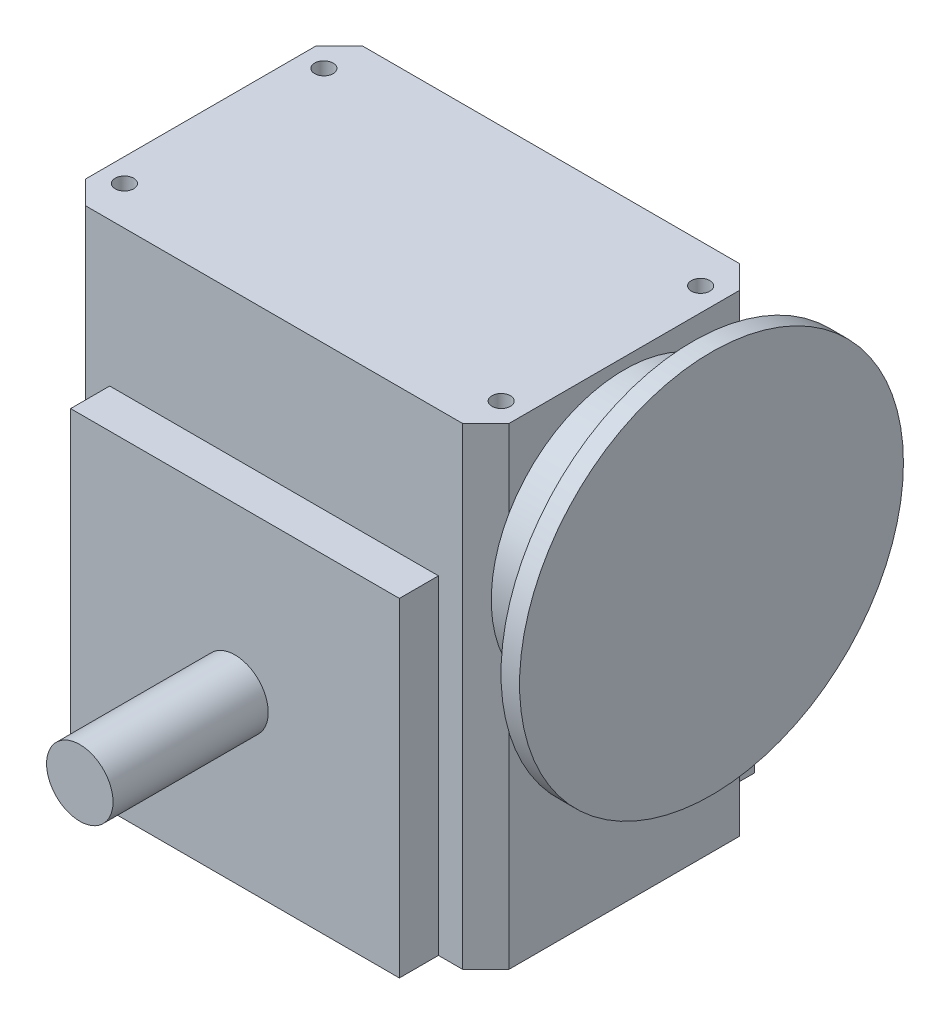
ISO-10303-21;
HEADER;
FILE_DESCRIPTION(('STEP AP214'),'2;1');
FILE_NAME('part.step','',(''),(''),'','','');
FILE_SCHEMA(('AUTOMOTIVE_DESIGN { 1 0 10303 214 1 1 1 1 }'));
ENDSEC;
DATA;
#1=APPLICATION_CONTEXT('core data for automotive mechanical design processes');
#2=APPLICATION_PROTOCOL_DEFINITION('international standard','automotive_design',2000,#1);
#3=PRODUCT_CONTEXT('',#1,'mechanical');
#4=PRODUCT('Part','Part','',(#3));
#5=PRODUCT_RELATED_PRODUCT_CATEGORY('part','',(#4));
#6=PRODUCT_DEFINITION_FORMATION('','',#4);
#7=PRODUCT_DEFINITION_CONTEXT('part definition',#1,'design');
#8=PRODUCT_DEFINITION('design','',#6,#7);
#9=PRODUCT_DEFINITION_SHAPE('','',#8);
#10=(LENGTH_UNIT() NAMED_UNIT(*) SI_UNIT(.MILLI.,.METRE.));
#11=(NAMED_UNIT(*) PLANE_ANGLE_UNIT() SI_UNIT($,.RADIAN.));
#12=(NAMED_UNIT(*) SI_UNIT($,.STERADIAN.) SOLID_ANGLE_UNIT());
#13=UNCERTAINTY_MEASURE_WITH_UNIT(LENGTH_MEASURE(1.E-05),#10,'distance_accuracy_value','');
#14=(GEOMETRIC_REPRESENTATION_CONTEXT(3) GLOBAL_UNCERTAINTY_ASSIGNED_CONTEXT((#13)) GLOBAL_UNIT_ASSIGNED_CONTEXT((#10,
#11,#12)) REPRESENTATION_CONTEXT('',''));
#15=CARTESIAN_POINT('',(0.,0.,0.));
#16=DIRECTION('',(0.,0.,1.));
#17=DIRECTION('',(1.,0.,0.));
#18=AXIS2_PLACEMENT_3D('',#15,#16,#17);
#19=CARTESIAN_POINT('',(128.4986,141.3002,0.));
#20=DIRECTION('',(-1.,0.,0.));
#21=DIRECTION('',(0.,0.,1.));
#22=AXIS2_PLACEMENT_3D('',#19,#20,#21);
#23=CYLINDRICAL_SURFACE('',#22,57.15);
#24=CARTESIAN_POINT('',(90.9955,141.3002,0.));
#25=DIRECTION('',(1.,0.,0.));
#26=DIRECTION('',(0.,0.,-1.));
#27=AXIS2_PLACEMENT_3D('',#24,#25,#26);
#28=CIRCLE('',#27,57.15);
#29=CARTESIAN_POINT('',(90.9955,169.921658344222,-49.4664999999999));
#30=VERTEX_POINT('',#29);
#31=CARTESIAN_POINT('',(90.9955,169.921658344221,49.4665));
#32=VERTEX_POINT('',#31);
#33=EDGE_CURVE('E260',#30,#32,#28,.T.);
#34=ORIENTED_EDGE('',*,*,#33,.T.);
#35=CARTESIAN_POINT('',(90.9955,112.678741655779,49.4665));
#36=VERTEX_POINT('',#35);
#37=EDGE_CURVE('E257',#32,#36,#28,.T.);
#38=ORIENTED_EDGE('',*,*,#37,.T.);
#39=CARTESIAN_POINT('',(90.9955,112.678741655778,-49.4664999999999));
#40=VERTEX_POINT('',#39);
#41=EDGE_CURVE('E51',#36,#40,#28,.T.);
#42=ORIENTED_EDGE('',*,*,#41,.T.);
#43=EDGE_CURVE('E252',#40,#30,#28,.T.);
#44=ORIENTED_EDGE('',*,*,#43,.T.);
#45=EDGE_LOOP('',(#34,#38,#42,#44));
#46=FACE_BOUND('',#45,.T.);
#47=CARTESIAN_POINT('',(120.523,141.3002,0.));
#48=DIRECTION('',(1.,0.,0.));
#49=DIRECTION('',(0.,0.,-1.));
#50=AXIS2_PLACEMENT_3D('',#47,#48,#49);
#51=CIRCLE('',#50,57.15);
#52=CARTESIAN_POINT('',(120.523,141.3002,-57.15));
#53=VERTEX_POINT('',#52);
#54=EDGE_CURVE('E11',#53,#53,#51,.T.);
#55=ORIENTED_EDGE('',*,*,#54,.F.);
#56=EDGE_LOOP('',(#55));
#57=FACE_BOUND('',#56,.T.);
#58=ADVANCED_FACE('F42',(#46,#57),#23,.T.);
#59=CARTESIAN_POINT('',(90.9955,203.2,-59.4995));
#60=DIRECTION('',(-1.,0.,0.));
#61=DIRECTION('',(0.,0.,1.));
#62=AXIS2_PLACEMENT_3D('',#59,#60,#61);
#63=PLANE('',#62);
#64=ORIENTED_EDGE('',*,*,#33,.F.);
#65=DIRECTION('',(0.,1.,0.));
#66=VECTOR('',#65,1.);
#67=CARTESIAN_POINT('',(90.9955,203.2,-49.4664999999999));
#68=LINE('',#67,#66);
#69=CARTESIAN_POINT('',(90.9955,203.2,-49.4664999999999));
#70=VERTEX_POINT('',#69);
#71=EDGE_CURVE('E243',#30,#70,#68,.T.);
#72=ORIENTED_EDGE('',*,*,#71,.T.);
#73=DIRECTION('',(0.,0.,-1.));
#74=VECTOR('',#73,1.);
#75=CARTESIAN_POINT('',(90.9955,203.2,-59.4995));
#76=LINE('',#75,#74);
#77=CARTESIAN_POINT('',(90.9955,203.2,49.4665));
#78=VERTEX_POINT('',#77);
#79=EDGE_CURVE('E345',#78,#70,#76,.T.);
#80=ORIENTED_EDGE('',*,*,#79,.F.);
#81=DIRECTION('',(0.,-1.,0.));
#82=VECTOR('',#81,1.);
#83=CARTESIAN_POINT('',(90.9955,203.2,49.4665));
#84=LINE('',#83,#82);
#85=EDGE_CURVE('E280',#78,#32,#84,.T.);
#86=ORIENTED_EDGE('',*,*,#85,.T.);
#87=EDGE_LOOP('',(#64,#72,#80,#86));
#88=FACE_BOUND('',#87,.T.);
#89=ADVANCED_FACE('F492',(#88),#63,.F.);
#90=CARTESIAN_POINT('',(-90.9955,203.2,59.4995));
#91=DIRECTION('',(0.,0.,-1.));
#92=DIRECTION('',(-1.,0.,0.));
#93=AXIS2_PLACEMENT_3D('',#90,#91,#92);
#94=PLANE('',#93);
#95=DIRECTION('',(1.,0.,0.));
#96=VECTOR('',#95,1.);
#97=CARTESIAN_POINT('',(-90.9955,203.2,59.4995));
#98=LINE('',#97,#96);
#99=CARTESIAN_POINT('',(-80.9625,203.2,59.4995));
#100=VERTEX_POINT('',#99);
#101=CARTESIAN_POINT('',(80.9624999999999,203.2,59.4995));
#102=VERTEX_POINT('',#101);
#103=EDGE_CURVE('E272',#100,#102,#98,.T.);
#104=ORIENTED_EDGE('',*,*,#103,.F.);
#105=DIRECTION('',(0.,-1.,0.));
#106=VECTOR('',#105,1.);
#107=CARTESIAN_POINT('',(-80.9625,203.2,59.4995));
#108=LINE('',#107,#106);
#109=CARTESIAN_POINT('',(-80.9625,0.,59.4995));
#110=VERTEX_POINT('',#109);
#111=EDGE_CURVE('E411',#100,#110,#108,.T.);
#112=ORIENTED_EDGE('',*,*,#111,.T.);
#113=DIRECTION('',(1.,0.,0.));
#114=VECTOR('',#113,1.);
#115=CARTESIAN_POINT('',(-90.9955,0.,59.4995));
#116=LINE('',#115,#114);
#117=CARTESIAN_POINT('',(-70.6501,0.,59.4995));
#118=VERTEX_POINT('',#117);
#119=EDGE_CURVE('E350',#110,#118,#116,.T.);
#120=ORIENTED_EDGE('',*,*,#119,.T.);
#121=DIRECTION('',(0.,-1.,0.));
#122=VECTOR('',#121,1.);
#123=CARTESIAN_POINT('',(-70.6501,0.,59.4995));
#124=LINE('',#123,#122);
#125=CARTESIAN_POINT('',(-70.6501,141.3002,59.4995));
#126=VERTEX_POINT('',#125);
#127=EDGE_CURVE('E462',#126,#118,#124,.T.);
#128=ORIENTED_EDGE('',*,*,#127,.F.);
#129=DIRECTION('',(-1.,0.,0.));
#130=VECTOR('',#129,1.);
#131=CARTESIAN_POINT('',(-70.6501,141.3002,59.4995));
#132=LINE('',#131,#130);
#133=CARTESIAN_POINT('',(70.6501,141.3002,59.4995));
#134=VERTEX_POINT('',#133);
#135=EDGE_CURVE('E308',#134,#126,#132,.T.);
#136=ORIENTED_EDGE('',*,*,#135,.F.);
#137=DIRECTION('',(0.,1.,0.));
#138=VECTOR('',#137,1.);
#139=CARTESIAN_POINT('',(70.6501,0.,59.4995));
#140=LINE('',#139,#138);
#141=CARTESIAN_POINT('',(70.6501,0.,59.4995));
#142=VERTEX_POINT('',#141);
#143=EDGE_CURVE('E311',#142,#134,#140,.T.);
#144=ORIENTED_EDGE('',*,*,#143,.F.);
#145=CARTESIAN_POINT('',(80.9624999999999,0.,59.4995));
#146=VERTEX_POINT('',#145);
#147=EDGE_CURVE('E372',#142,#146,#116,.T.);
#148=ORIENTED_EDGE('',*,*,#147,.T.);
#149=DIRECTION('',(0.,1.,0.));
#150=VECTOR('',#149,1.);
#151=CARTESIAN_POINT('',(80.9624999999999,203.2,59.4995));
#152=LINE('',#151,#150);
#153=EDGE_CURVE('E408',#146,#102,#152,.T.);
#154=ORIENTED_EDGE('',*,*,#153,.T.);
#155=EDGE_LOOP('',(#104,#112,#120,#128,#136,#144,#148,#154));
#156=FACE_BOUND('',#155,.T.);
#157=ADVANCED_FACE('F450',(#156),#94,.F.);
#158=ORIENTED_EDGE('',*,*,#41,.F.);
#159=CARTESIAN_POINT('',(90.9955,0.,49.4665));
#160=VERTEX_POINT('',#159);
#161=EDGE_CURVE('E281',#36,#160,#84,.T.);
#162=ORIENTED_EDGE('',*,*,#161,.T.);
#163=DIRECTION('',(0.,0.,-1.));
#164=VECTOR('',#163,1.);
#165=CARTESIAN_POINT('',(90.9955,0.,-59.4995));
#166=LINE('',#165,#164);
#167=CARTESIAN_POINT('',(90.9955,0.,-49.4664999999999));
#168=VERTEX_POINT('',#167);
#169=EDGE_CURVE('E239',#160,#168,#166,.T.);
#170=ORIENTED_EDGE('',*,*,#169,.T.);
#171=EDGE_CURVE('E235',#168,#40,#68,.T.);
#172=ORIENTED_EDGE('',*,*,#171,.T.);
#173=EDGE_LOOP('',(#158,#162,#170,#172));
#174=FACE_BOUND('',#173,.T.);
#175=ADVANCED_FACE('F237',(#174),#63,.F.);
#176=CARTESIAN_POINT('',(-90.9955,203.2,-59.4995));
#177=DIRECTION('',(0.,0.,1.));
#178=DIRECTION('',(1.,0.,0.));
#179=AXIS2_PLACEMENT_3D('',#176,#177,#178);
#180=PLANE('',#179);
#181=DIRECTION('',(-1.,0.,0.));
#182=VECTOR('',#181,1.);
#183=CARTESIAN_POINT('',(-70.6501,141.3002,-59.4995));
#184=LINE('',#183,#182);
#185=CARTESIAN_POINT('',(70.6501,141.3002,-59.4995));
#186=VERTEX_POINT('',#185);
#187=CARTESIAN_POINT('',(-70.6501,141.3002,-59.4995));
#188=VERTEX_POINT('',#187);
#189=EDGE_CURVE('E470',#186,#188,#184,.T.);
#190=ORIENTED_EDGE('',*,*,#189,.T.);
#191=DIRECTION('',(0.,-1.,0.));
#192=VECTOR('',#191,1.);
#193=CARTESIAN_POINT('',(-70.6501,0.,-59.4995));
#194=LINE('',#193,#192);
#195=CARTESIAN_POINT('',(-70.6501,0.,-59.4995));
#196=VERTEX_POINT('',#195);
#197=EDGE_CURVE('E269',#188,#196,#194,.T.);
#198=ORIENTED_EDGE('',*,*,#197,.T.);
#199=DIRECTION('',(-1.,0.,0.));
#200=VECTOR('',#199,1.);
#201=CARTESIAN_POINT('',(-90.9955,0.,-59.4995));
#202=LINE('',#201,#200);
#203=CARTESIAN_POINT('',(-80.9624999999999,0.,-59.4995));
#204=VERTEX_POINT('',#203);
#205=EDGE_CURVE('E363',#196,#204,#202,.T.);
#206=ORIENTED_EDGE('',*,*,#205,.T.);
#207=DIRECTION('',(0.,1.,0.));
#208=VECTOR('',#207,1.);
#209=CARTESIAN_POINT('',(-80.9624999999999,203.2,-59.4995));
#210=LINE('',#209,#208);
#211=CARTESIAN_POINT('',(-80.9624999999999,203.2,-59.4995));
#212=VERTEX_POINT('',#211);
#213=EDGE_CURVE('E286',#204,#212,#210,.T.);
#214=ORIENTED_EDGE('',*,*,#213,.T.);
#215=DIRECTION('',(-1.,0.,0.));
#216=VECTOR('',#215,1.);
#217=CARTESIAN_POINT('',(-90.9955,203.2,-59.4995));
#218=LINE('',#217,#216);
#219=CARTESIAN_POINT('',(80.9624999999999,203.2,-59.4995));
#220=VERTEX_POINT('',#219);
#221=EDGE_CURVE('E349',#220,#212,#218,.T.);
#222=ORIENTED_EDGE('',*,*,#221,.F.);
#223=DIRECTION('',(0.,-1.,0.));
#224=VECTOR('',#223,1.);
#225=CARTESIAN_POINT('',(80.9624999999999,203.2,-59.4995));
#226=LINE('',#225,#224);
#227=CARTESIAN_POINT('',(80.9624999999999,0.,-59.4995));
#228=VERTEX_POINT('',#227);
#229=EDGE_CURVE('E398',#220,#228,#226,.T.);
#230=ORIENTED_EDGE('',*,*,#229,.T.);
#231=CARTESIAN_POINT('',(70.6501,0.,-59.4995));
#232=VERTEX_POINT('',#231);
#233=EDGE_CURVE('E364',#228,#232,#202,.T.);
#234=ORIENTED_EDGE('',*,*,#233,.T.);
#235=DIRECTION('',(0.,1.,0.));
#236=VECTOR('',#235,1.);
#237=CARTESIAN_POINT('',(70.6501,0.,-59.4995));
#238=LINE('',#237,#236);
#239=EDGE_CURVE('E472',#232,#186,#238,.T.);
#240=ORIENTED_EDGE('',*,*,#239,.T.);
#241=EDGE_LOOP('',(#190,#198,#206,#214,#222,#230,#234,#240));
#242=FACE_BOUND('',#241,.T.);
#243=ADVANCED_FACE('F433',(#242),#180,.F.);
#244=CARTESIAN_POINT('',(-90.9955,203.2,-59.4995));
#245=DIRECTION('',(1.,0.,0.));
#246=DIRECTION('',(0.,0.,-1.));
#247=AXIS2_PLACEMENT_3D('',#244,#245,#246);
#248=PLANE('',#247);
#249=DIRECTION('',(0.,0.,1.));
#250=VECTOR('',#249,1.);
#251=CARTESIAN_POINT('',(-90.9955,203.2,-59.4995));
#252=LINE('',#251,#250);
#253=CARTESIAN_POINT('',(-90.9955,203.2,-49.4664999999999));
#254=VERTEX_POINT('',#253);
#255=CARTESIAN_POINT('',(-90.9955,203.2,49.4665));
#256=VERTEX_POINT('',#255);
#257=EDGE_CURVE('E354',#254,#256,#252,.T.);
#258=ORIENTED_EDGE('',*,*,#257,.F.);
#259=DIRECTION('',(0.,-1.,0.));
#260=VECTOR('',#259,1.);
#261=CARTESIAN_POINT('',(-90.9955,203.2,-49.4664999999999));
#262=LINE('',#261,#260);
#263=CARTESIAN_POINT('',(-90.9955,0.,-49.4664999999999));
#264=VERTEX_POINT('',#263);
#265=EDGE_CURVE('E381',#254,#264,#262,.T.);
#266=ORIENTED_EDGE('',*,*,#265,.T.);
#267=DIRECTION('',(0.,0.,1.));
#268=VECTOR('',#267,1.);
#269=CARTESIAN_POINT('',(-90.9955,0.,-59.4995));
#270=LINE('',#269,#268);
#271=CARTESIAN_POINT('',(-90.9955,0.,49.4665));
#272=VERTEX_POINT('',#271);
#273=EDGE_CURVE('E368',#264,#272,#270,.T.);
#274=ORIENTED_EDGE('',*,*,#273,.T.);
#275=DIRECTION('',(0.,1.,0.));
#276=VECTOR('',#275,1.);
#277=CARTESIAN_POINT('',(-90.9955,203.2,49.4665));
#278=LINE('',#277,#276);
#279=EDGE_CURVE('E378',#272,#256,#278,.T.);
#280=ORIENTED_EDGE('',*,*,#279,.T.);
#281=EDGE_LOOP('',(#258,#266,#274,#280));
#282=FACE_BOUND('',#281,.T.);
#283=ADVANCED_FACE('F444',(#282),#248,.F.);
#284=CARTESIAN_POINT('',(0.,203.2,0.));
#285=DIRECTION('',(0.,1.,0.));
#286=DIRECTION('',(0.,0.,1.));
#287=AXIS2_PLACEMENT_3D('',#284,#285,#286);
#288=PLANE('',#287);
#289=CARTESIAN_POINT('',(80.9625,203.2,-42.8625));
#290=DIRECTION('',(0.,1.,0.));
#291=DIRECTION('',(0.,0.,1.));
#292=AXIS2_PLACEMENT_3D('',#289,#290,#291);
#293=CIRCLE('',#292,3.96874999999999);
#294=CARTESIAN_POINT('',(80.9625,203.2,-38.89375));
#295=VERTEX_POINT('',#294);
#296=EDGE_CURVE('E324',#295,#295,#293,.T.);
#297=ORIENTED_EDGE('',*,*,#296,.F.);
#298=EDGE_LOOP('',(#297));
#299=FACE_BOUND('',#298,.T.);
#300=CARTESIAN_POINT('',(80.9625,203.2,42.8625));
#301=DIRECTION('',(0.,1.,0.));
#302=DIRECTION('',(0.,0.,1.));
#303=AXIS2_PLACEMENT_3D('',#300,#301,#302);
#304=CIRCLE('',#303,3.96874999999999);
#305=CARTESIAN_POINT('',(80.9625,203.2,46.83125));
#306=VERTEX_POINT('',#305);
#307=EDGE_CURVE('E288',#306,#306,#304,.T.);
#308=ORIENTED_EDGE('',*,*,#307,.F.);
#309=EDGE_LOOP('',(#308));
#310=FACE_BOUND('',#309,.T.);
#311=CARTESIAN_POINT('',(-80.9625,203.2,42.8625));
#312=DIRECTION('',(0.,1.,0.));
#313=DIRECTION('',(0.,0.,1.));
#314=AXIS2_PLACEMENT_3D('',#311,#312,#313);
#315=CIRCLE('',#314,3.96874999999999);
#316=CARTESIAN_POINT('',(-80.9625,203.2,46.83125));
#317=VERTEX_POINT('',#316);
#318=EDGE_CURVE('E296',#317,#317,#315,.T.);
#319=ORIENTED_EDGE('',*,*,#318,.F.);
#320=EDGE_LOOP('',(#319));
#321=FACE_BOUND('',#320,.T.);
#322=CARTESIAN_POINT('',(-80.9625,203.2,-42.8625));
#323=DIRECTION('',(0.,1.,0.));
#324=DIRECTION('',(0.,0.,1.));
#325=AXIS2_PLACEMENT_3D('',#322,#323,#324);
#326=CIRCLE('',#325,3.96874999999999);
#327=CARTESIAN_POINT('',(-80.9625,203.2,-38.89375));
#328=VERTEX_POINT('',#327);
#329=EDGE_CURVE('E277',#328,#328,#326,.T.);
#330=ORIENTED_EDGE('',*,*,#329,.F.);
#331=EDGE_LOOP('',(#330));
#332=FACE_BOUND('',#331,.T.);
#333=ORIENTED_EDGE('',*,*,#221,.T.);
#334=DIRECTION('',(0.70710678118655,0.,-0.707106781186546));
#335=VECTOR('',#334,1.);
#336=CARTESIAN_POINT('',(-70.2309999999997,203.2,-70.2310000000001));
#337=LINE('',#336,#335);
#338=EDGE_CURVE('E328',#212,#254,#337,.F.);
#339=ORIENTED_EDGE('',*,*,#338,.T.);
#340=ORIENTED_EDGE('',*,*,#257,.T.);
#341=DIRECTION('',(-0.707106781186547,0.,-0.707106781186549));
#342=VECTOR('',#341,1.);
#343=CARTESIAN_POINT('',(-70.2310000000001,203.2,70.2309999999999));
#344=LINE('',#343,#342);
#345=EDGE_CURVE('E326',#256,#100,#344,.F.);
#346=ORIENTED_EDGE('',*,*,#345,.T.);
#347=ORIENTED_EDGE('',*,*,#103,.T.);
#348=DIRECTION('',(-0.707106781186549,0.,0.707106781186546));
#349=VECTOR('',#348,1.);
#350=CARTESIAN_POINT('',(70.2309999999997,203.2,70.2310000000001));
#351=LINE('',#350,#349);
#352=EDGE_CURVE('E283',#102,#78,#351,.F.);
#353=ORIENTED_EDGE('',*,*,#352,.T.);
#354=ORIENTED_EDGE('',*,*,#79,.T.);
#355=DIRECTION('',(0.707106781186547,0.,0.707106781186549));
#356=VECTOR('',#355,1.);
#357=CARTESIAN_POINT('',(70.2310000000001,203.2,-70.2309999999999));
#358=LINE('',#357,#356);
#359=EDGE_CURVE('E285',#70,#220,#358,.F.);
#360=ORIENTED_EDGE('',*,*,#359,.T.);
#361=EDGE_LOOP('',(#333,#339,#340,#346,#347,#353,#354,#360));
#362=FACE_BOUND('',#361,.T.);
#363=ADVANCED_FACE('F438',(#299,#310,#321,#332,#362),#288,.T.);
#364=CARTESIAN_POINT('',(0.,0.,0.));
#365=DIRECTION('',(0.,1.,0.));
#366=DIRECTION('',(0.,0.,1.));
#367=AXIS2_PLACEMENT_3D('',#364,#365,#366);
#368=PLANE('',#367);
#369=CARTESIAN_POINT('',(-80.9625,0.,-42.8625));
#370=DIRECTION('',(0.,-1.,0.));
#371=DIRECTION('',(0.,0.,-1.));
#372=AXIS2_PLACEMENT_3D('',#369,#370,#371);
#373=CIRCLE('',#372,3.96874999999999);
#374=CARTESIAN_POINT('',(-80.9625,0.,-46.83125));
#375=VERTEX_POINT('',#374);
#376=EDGE_CURVE('E477',#375,#375,#373,.T.);
#377=ORIENTED_EDGE('',*,*,#376,.F.);
#378=EDGE_LOOP('',(#377));
#379=FACE_BOUND('',#378,.T.);
#380=CARTESIAN_POINT('',(-80.9625,0.,42.8625));
#381=DIRECTION('',(0.,-1.,0.));
#382=DIRECTION('',(0.,0.,-1.));
#383=AXIS2_PLACEMENT_3D('',#380,#381,#382);
#384=CIRCLE('',#383,3.96874999999999);
#385=CARTESIAN_POINT('',(-80.9625,0.,38.89375));
#386=VERTEX_POINT('',#385);
#387=EDGE_CURVE('E976',#386,#386,#384,.T.);
#388=ORIENTED_EDGE('',*,*,#387,.F.);
#389=EDGE_LOOP('',(#388));
#390=FACE_BOUND('',#389,.T.);
#391=CARTESIAN_POINT('',(80.9625,0.,42.8625));
#392=DIRECTION('',(0.,-1.,0.));
#393=DIRECTION('',(0.,0.,-1.));
#394=AXIS2_PLACEMENT_3D('',#391,#392,#393);
#395=CIRCLE('',#394,3.96874999999999);
#396=CARTESIAN_POINT('',(80.9625,0.,38.89375));
#397=VERTEX_POINT('',#396);
#398=EDGE_CURVE('E984',#397,#397,#395,.T.);
#399=ORIENTED_EDGE('',*,*,#398,.F.);
#400=EDGE_LOOP('',(#399));
#401=FACE_BOUND('',#400,.T.);
#402=CARTESIAN_POINT('',(80.9625,0.,-42.8625));
#403=DIRECTION('',(0.,-1.,0.));
#404=DIRECTION('',(0.,0.,-1.));
#405=AXIS2_PLACEMENT_3D('',#402,#403,#404);
#406=CIRCLE('',#405,3.96874999999999);
#407=CARTESIAN_POINT('',(80.9625,0.,-46.83125));
#408=VERTEX_POINT('',#407);
#409=EDGE_CURVE('E943',#408,#408,#406,.T.);
#410=ORIENTED_EDGE('',*,*,#409,.F.);
#411=EDGE_LOOP('',(#410));
#412=FACE_BOUND('',#411,.T.);
#413=ORIENTED_EDGE('',*,*,#273,.F.);
#414=DIRECTION('',(-0.70710678118655,0.,0.707106781186546));
#415=VECTOR('',#414,1.);
#416=CARTESIAN_POINT('',(-90.9955,0.,-49.4664999999999));
#417=LINE('',#416,#415);
#418=EDGE_CURVE('E394',#264,#204,#417,.F.);
#419=ORIENTED_EDGE('',*,*,#418,.T.);
#420=ORIENTED_EDGE('',*,*,#205,.F.);
#421=DIRECTION('',(0.,0.,1.));
#422=VECTOR('',#421,1.);
#423=CARTESIAN_POINT('',(-70.6501,0.,-76.3016));
#424=LINE('',#423,#422);
#425=CARTESIAN_POINT('',(-70.6501,0.,-76.3016));
#426=VERTEX_POINT('',#425);
#427=EDGE_CURVE('E954',#426,#196,#424,.T.);
#428=ORIENTED_EDGE('',*,*,#427,.F.);
#429=DIRECTION('',(1.,0.,0.));
#430=VECTOR('',#429,1.);
#431=CARTESIAN_POINT('',(-70.6501,0.,-76.3016));
#432=LINE('',#431,#430);
#433=CARTESIAN_POINT('',(70.6501,0.,-76.3016));
#434=VERTEX_POINT('',#433);
#435=EDGE_CURVE('E956',#426,#434,#432,.T.);
#436=ORIENTED_EDGE('',*,*,#435,.T.);
#437=DIRECTION('',(0.,0.,1.));
#438=VECTOR('',#437,1.);
#439=CARTESIAN_POINT('',(70.6501,0.,-76.3016));
#440=LINE('',#439,#438);
#441=EDGE_CURVE('E480',#434,#232,#440,.T.);
#442=ORIENTED_EDGE('',*,*,#441,.T.);
#443=ORIENTED_EDGE('',*,*,#233,.F.);
#444=DIRECTION('',(-0.707106781186547,0.,-0.707106781186549));
#445=VECTOR('',#444,1.);
#446=CARTESIAN_POINT('',(80.9624999999999,0.,-59.4995));
#447=LINE('',#446,#445);
#448=EDGE_CURVE('E388',#228,#168,#447,.F.);
#449=ORIENTED_EDGE('',*,*,#448,.T.);
#450=ORIENTED_EDGE('',*,*,#169,.F.);
#451=DIRECTION('',(0.707106781186549,0.,-0.707106781186546));
#452=VECTOR('',#451,1.);
#453=CARTESIAN_POINT('',(90.9955,0.,49.4665));
#454=LINE('',#453,#452);
#455=EDGE_CURVE('E385',#160,#146,#454,.F.);
#456=ORIENTED_EDGE('',*,*,#455,.T.);
#457=ORIENTED_EDGE('',*,*,#147,.F.);
#458=DIRECTION('',(0.,0.,-1.));
#459=VECTOR('',#458,1.);
#460=CARTESIAN_POINT('',(70.6501,0.,76.3016));
#461=LINE('',#460,#459);
#462=CARTESIAN_POINT('',(70.6501,0.,76.3016));
#463=VERTEX_POINT('',#462);
#464=EDGE_CURVE('E306',#463,#142,#461,.T.);
#465=ORIENTED_EDGE('',*,*,#464,.F.);
#466=DIRECTION('',(1.,0.,0.));
#467=VECTOR('',#466,1.);
#468=CARTESIAN_POINT('',(-70.6501,0.,76.3016));
#469=LINE('',#468,#467);
#470=CARTESIAN_POINT('',(-70.6501,0.,76.3016));
#471=VERTEX_POINT('',#470);
#472=EDGE_CURVE('E457',#471,#463,#469,.T.);
#473=ORIENTED_EDGE('',*,*,#472,.F.);
#474=DIRECTION('',(0.,0.,-1.));
#475=VECTOR('',#474,1.);
#476=CARTESIAN_POINT('',(-70.6501,0.,76.3016));
#477=LINE('',#476,#475);
#478=EDGE_CURVE('E341',#471,#118,#477,.T.);
#479=ORIENTED_EDGE('',*,*,#478,.T.);
#480=ORIENTED_EDGE('',*,*,#119,.F.);
#481=DIRECTION('',(0.707106781186547,0.,0.707106781186549));
#482=VECTOR('',#481,1.);
#483=CARTESIAN_POINT('',(-80.9625,0.,59.4995));
#484=LINE('',#483,#482);
#485=EDGE_CURVE('E391',#110,#272,#484,.F.);
#486=ORIENTED_EDGE('',*,*,#485,.T.);
#487=EDGE_LOOP('',(#413,#419,#420,#428,#436,#442,#443,#449,#450,#456,#457,#465,#473,#479,#480,#486));
#488=FACE_BOUND('',#487,.T.);
#489=ADVANCED_FACE('F427',(#379,#390,#401,#412,#488),#368,.F.);
#490=CARTESIAN_POINT('',(-70.6501,0.,76.3016));
#491=DIRECTION('',(1.,0.,0.));
#492=DIRECTION('',(0.,0.,-1.));
#493=AXIS2_PLACEMENT_3D('',#490,#491,#492);
#494=PLANE('',#493);
#495=ORIENTED_EDGE('',*,*,#127,.T.);
#496=ORIENTED_EDGE('',*,*,#478,.F.);
#497=DIRECTION('',(0.,-1.,0.));
#498=VECTOR('',#497,1.);
#499=CARTESIAN_POINT('',(-70.6501,0.,76.3016));
#500=LINE('',#499,#498);
#501=CARTESIAN_POINT('',(-70.6501,141.3002,76.3016));
#502=VERTEX_POINT('',#501);
#503=EDGE_CURVE('E310',#502,#471,#500,.T.);
#504=ORIENTED_EDGE('',*,*,#503,.F.);
#505=DIRECTION('',(0.,0.,-1.));
#506=VECTOR('',#505,1.);
#507=CARTESIAN_POINT('',(-70.6501,141.3002,76.3016));
#508=LINE('',#507,#506);
#509=EDGE_CURVE('E300',#502,#126,#508,.T.);
#510=ORIENTED_EDGE('',*,*,#509,.T.);
#511=EDGE_LOOP('',(#495,#496,#504,#510));
#512=FACE_BOUND('',#511,.T.);
#513=ADVANCED_FACE('F612',(#512),#494,.F.);
#514=CARTESIAN_POINT('',(70.6501,0.,76.3016));
#515=DIRECTION('',(-1.,0.,0.));
#516=DIRECTION('',(0.,0.,1.));
#517=AXIS2_PLACEMENT_3D('',#514,#515,#516);
#518=PLANE('',#517);
#519=ORIENTED_EDGE('',*,*,#143,.T.);
#520=DIRECTION('',(0.,0.,-1.));
#521=VECTOR('',#520,1.);
#522=CARTESIAN_POINT('',(70.6501,141.3002,76.3016));
#523=LINE('',#522,#521);
#524=CARTESIAN_POINT('',(70.6501,141.3002,76.3016));
#525=VERTEX_POINT('',#524);
#526=EDGE_CURVE('E303',#525,#134,#523,.T.);
#527=ORIENTED_EDGE('',*,*,#526,.F.);
#528=DIRECTION('',(0.,1.,0.));
#529=VECTOR('',#528,1.);
#530=CARTESIAN_POINT('',(70.6501,0.,76.3016));
#531=LINE('',#530,#529);
#532=EDGE_CURVE('E301',#463,#525,#531,.T.);
#533=ORIENTED_EDGE('',*,*,#532,.F.);
#534=ORIENTED_EDGE('',*,*,#464,.T.);
#535=EDGE_LOOP('',(#519,#527,#533,#534));
#536=FACE_BOUND('',#535,.T.);
#537=ADVANCED_FACE('F608',(#536),#518,.F.);
#538=CARTESIAN_POINT('',(-70.6501,141.3002,76.3016));
#539=DIRECTION('',(0.,-1.,0.));
#540=DIRECTION('',(0.,0.,-1.));
#541=AXIS2_PLACEMENT_3D('',#538,#539,#540);
#542=PLANE('',#541);
#543=ORIENTED_EDGE('',*,*,#135,.T.);
#544=ORIENTED_EDGE('',*,*,#509,.F.);
#545=DIRECTION('',(-1.,0.,0.));
#546=VECTOR('',#545,1.);
#547=CARTESIAN_POINT('',(-70.6501,141.3002,76.3016));
#548=LINE('',#547,#546);
#549=EDGE_CURVE('E298',#525,#502,#548,.T.);
#550=ORIENTED_EDGE('',*,*,#549,.F.);
#551=ORIENTED_EDGE('',*,*,#526,.T.);
#552=EDGE_LOOP('',(#543,#544,#550,#551));
#553=FACE_BOUND('',#552,.T.);
#554=ADVANCED_FACE('F604',(#553),#542,.F.);
#555=CARTESIAN_POINT('',(0.,0.,76.3016));
#556=DIRECTION('',(0.,0.,-1.));
#557=DIRECTION('',(-1.,0.,0.));
#558=AXIS2_PLACEMENT_3D('',#555,#556,#557);
#559=PLANE('',#558);
#560=CARTESIAN_POINT('',(0.,70.6501,76.3016));
#561=DIRECTION('',(0.,0.,-1.));
#562=DIRECTION('',(-1.,0.,0.));
#563=AXIS2_PLACEMENT_3D('',#560,#561,#562);
#564=CIRCLE('',#563,14.2875);
#565=CARTESIAN_POINT('',(-14.2875,70.6501,76.3016));
#566=VERTEX_POINT('',#565);
#567=EDGE_CURVE('E360',#566,#566,#564,.F.);
#568=ORIENTED_EDGE('',*,*,#567,.F.);
#569=EDGE_LOOP('',(#568));
#570=FACE_BOUND('',#569,.T.);
#571=ORIENTED_EDGE('',*,*,#503,.T.);
#572=ORIENTED_EDGE('',*,*,#472,.T.);
#573=ORIENTED_EDGE('',*,*,#532,.T.);
#574=ORIENTED_EDGE('',*,*,#549,.T.);
#575=EDGE_LOOP('',(#571,#572,#573,#574));
#576=FACE_BOUND('',#575,.T.);
#577=ADVANCED_FACE('F600',(#570,#576),#559,.F.);
#578=CARTESIAN_POINT('',(0.,70.6501,143.002));
#579=DIRECTION('',(0.,0.,-1.));
#580=DIRECTION('',(-1.,0.,0.));
#581=AXIS2_PLACEMENT_3D('',#578,#579,#580);
#582=CYLINDRICAL_SURFACE('',#581,14.2875);
#583=CARTESIAN_POINT('',(0.,70.6501,143.002));
#584=DIRECTION('',(0.,0.,1.));
#585=DIRECTION('',(1.,0.,0.));
#586=AXIS2_PLACEMENT_3D('',#583,#584,#585);
#587=CIRCLE('',#586,14.2875);
#588=CARTESIAN_POINT('',(14.2875,70.6501,143.002));
#589=VERTEX_POINT('',#588);
#590=EDGE_CURVE('E276',#589,#589,#587,.T.);
#591=ORIENTED_EDGE('',*,*,#590,.F.);
#592=EDGE_LOOP('',(#591));
#593=FACE_BOUND('',#592,.T.);
#594=ORIENTED_EDGE('',*,*,#567,.T.);
#595=EDGE_LOOP('',(#594));
#596=FACE_BOUND('',#595,.T.);
#597=ADVANCED_FACE('F596',(#593,#596),#582,.T.);
#598=CARTESIAN_POINT('',(0.,70.6501,143.002));
#599=DIRECTION('',(0.,0.,1.));
#600=DIRECTION('',(1.,0.,0.));
#601=AXIS2_PLACEMENT_3D('',#598,#599,#600);
#602=PLANE('',#601);
#603=ORIENTED_EDGE('',*,*,#590,.T.);
#604=EDGE_LOOP('',(#603));
#605=FACE_BOUND('',#604,.T.);
#606=ADVANCED_FACE('F592',(#605),#602,.T.);
#607=CARTESIAN_POINT('',(-80.9625,190.5,-42.8625));
#608=DIRECTION('',(0.,1.,0.));
#609=DIRECTION('',(0.,0.,1.));
#610=AXIS2_PLACEMENT_3D('',#607,#608,#609);
#611=CONICAL_SURFACE('',#610,3.96874999999999,1.02974425867665);
#612=CARTESIAN_POINT('',(-80.9625,188.115334418234,-42.8625));
#613=VERTEX_POINT('',#612);
#614=VERTEX_LOOP('',#613);
#615=FACE_BOUND('',#614,.T.);
#616=CARTESIAN_POINT('',(-80.9625,190.5,-42.8625));
#617=DIRECTION('',(0.,1.,0.));
#618=DIRECTION('',(0.,0.,1.));
#619=AXIS2_PLACEMENT_3D('',#616,#617,#618);
#620=CIRCLE('',#619,3.96874999999999);
#621=CARTESIAN_POINT('',(-80.9625,190.5,-38.89375));
#622=VERTEX_POINT('',#621);
#623=EDGE_CURVE('E273',#622,#622,#620,.T.);
#624=ORIENTED_EDGE('',*,*,#623,.T.);
#625=EDGE_LOOP('',(#624));
#626=FACE_BOUND('',#625,.T.);
#627=ADVANCED_FACE('F588',(#615,#626),#611,.F.);
#628=CARTESIAN_POINT('',(-80.9625,203.2,-42.8625));
#629=DIRECTION('',(0.,1.,0.));
#630=DIRECTION('',(0.,0.,1.));
#631=AXIS2_PLACEMENT_3D('',#628,#629,#630);
#632=CYLINDRICAL_SURFACE('',#631,3.96874999999999);
#633=ORIENTED_EDGE('',*,*,#623,.F.);
#634=EDGE_LOOP('',(#633));
#635=FACE_BOUND('',#634,.T.);
#636=ORIENTED_EDGE('',*,*,#329,.T.);
#637=EDGE_LOOP('',(#636));
#638=FACE_BOUND('',#637,.T.);
#639=ADVANCED_FACE('F584',(#635,#638),#632,.F.);
#640=CARTESIAN_POINT('',(-80.9625,190.5,42.8625));
#641=DIRECTION('',(0.,1.,0.));
#642=DIRECTION('',(0.,0.,1.));
#643=AXIS2_PLACEMENT_3D('',#640,#641,#642);
#644=CONICAL_SURFACE('',#643,3.96874999999999,1.02974425867665);
#645=CARTESIAN_POINT('',(-80.9625,188.115334418234,42.8625));
#646=VERTEX_POINT('',#645);
#647=VERTEX_LOOP('',#646);
#648=FACE_BOUND('',#647,.T.);
#649=CARTESIAN_POINT('',(-80.9625,190.5,42.8625));
#650=DIRECTION('',(0.,1.,0.));
#651=DIRECTION('',(0.,0.,1.));
#652=AXIS2_PLACEMENT_3D('',#649,#650,#651);
#653=CIRCLE('',#652,3.96874999999999);
#654=CARTESIAN_POINT('',(-80.9625,190.5,46.83125));
#655=VERTEX_POINT('',#654);
#656=EDGE_CURVE('E315',#655,#655,#653,.T.);
#657=ORIENTED_EDGE('',*,*,#656,.T.);
#658=EDGE_LOOP('',(#657));
#659=FACE_BOUND('',#658,.T.);
#660=ADVANCED_FACE('F580',(#648,#659),#644,.F.);
#661=CARTESIAN_POINT('',(-80.9625,203.2,42.8625));
#662=DIRECTION('',(0.,1.,0.));
#663=DIRECTION('',(0.,0.,1.));
#664=AXIS2_PLACEMENT_3D('',#661,#662,#663);
#665=CYLINDRICAL_SURFACE('',#664,3.96874999999999);
#666=ORIENTED_EDGE('',*,*,#656,.F.);
#667=EDGE_LOOP('',(#666));
#668=FACE_BOUND('',#667,.T.);
#669=ORIENTED_EDGE('',*,*,#318,.T.);
#670=EDGE_LOOP('',(#669));
#671=FACE_BOUND('',#670,.T.);
#672=ADVANCED_FACE('F576',(#668,#671),#665,.F.);
#673=CARTESIAN_POINT('',(80.9625,190.5,42.8625));
#674=DIRECTION('',(0.,1.,0.));
#675=DIRECTION('',(0.,0.,1.));
#676=AXIS2_PLACEMENT_3D('',#673,#674,#675);
#677=CONICAL_SURFACE('',#676,3.96874999999999,1.02974425867665);
#678=CARTESIAN_POINT('',(80.9625,188.115334418234,42.8625));
#679=VERTEX_POINT('',#678);
#680=VERTEX_LOOP('',#679);
#681=FACE_BOUND('',#680,.T.);
#682=CARTESIAN_POINT('',(80.9625,190.5,42.8625));
#683=DIRECTION('',(0.,1.,0.));
#684=DIRECTION('',(0.,0.,1.));
#685=AXIS2_PLACEMENT_3D('',#682,#683,#684);
#686=CIRCLE('',#685,3.96874999999999);
#687=CARTESIAN_POINT('',(80.9625,190.5,46.83125));
#688=VERTEX_POINT('',#687);
#689=EDGE_CURVE('E291',#688,#688,#686,.T.);
#690=ORIENTED_EDGE('',*,*,#689,.T.);
#691=EDGE_LOOP('',(#690));
#692=FACE_BOUND('',#691,.T.);
#693=ADVANCED_FACE('F572',(#681,#692),#677,.F.);
#694=CARTESIAN_POINT('',(80.9625,203.2,42.8625));
#695=DIRECTION('',(0.,1.,0.));
#696=DIRECTION('',(0.,0.,1.));
#697=AXIS2_PLACEMENT_3D('',#694,#695,#696);
#698=CYLINDRICAL_SURFACE('',#697,3.96874999999999);
#699=ORIENTED_EDGE('',*,*,#689,.F.);
#700=EDGE_LOOP('',(#699));
#701=FACE_BOUND('',#700,.T.);
#702=ORIENTED_EDGE('',*,*,#307,.T.);
#703=EDGE_LOOP('',(#702));
#704=FACE_BOUND('',#703,.T.);
#705=ADVANCED_FACE('F568',(#701,#704),#698,.F.);
#706=CARTESIAN_POINT('',(80.9625,190.5,-42.8625));
#707=DIRECTION('',(0.,1.,0.));
#708=DIRECTION('',(0.,0.,1.));
#709=AXIS2_PLACEMENT_3D('',#706,#707,#708);
#710=CONICAL_SURFACE('',#709,3.96874999999999,1.02974425867665);
#711=CARTESIAN_POINT('',(80.9625,188.115334418234,-42.8625));
#712=VERTEX_POINT('',#711);
#713=VERTEX_LOOP('',#712);
#714=FACE_BOUND('',#713,.T.);
#715=CARTESIAN_POINT('',(80.9625,190.5,-42.8625));
#716=DIRECTION('',(0.,1.,0.));
#717=DIRECTION('',(0.,0.,1.));
#718=AXIS2_PLACEMENT_3D('',#715,#716,#717);
#719=CIRCLE('',#718,3.96874999999999);
#720=CARTESIAN_POINT('',(80.9625,190.5,-38.89375));
#721=VERTEX_POINT('',#720);
#722=EDGE_CURVE('E292',#721,#721,#719,.T.);
#723=ORIENTED_EDGE('',*,*,#722,.T.);
#724=EDGE_LOOP('',(#723));
#725=FACE_BOUND('',#724,.T.);
#726=ADVANCED_FACE('F564',(#714,#725),#710,.F.);
#727=CARTESIAN_POINT('',(80.9625,203.2,-42.8625));
#728=DIRECTION('',(0.,1.,0.));
#729=DIRECTION('',(0.,0.,1.));
#730=AXIS2_PLACEMENT_3D('',#727,#728,#729);
#731=CYLINDRICAL_SURFACE('',#730,3.96874999999999);
#732=ORIENTED_EDGE('',*,*,#722,.F.);
#733=EDGE_LOOP('',(#732));
#734=FACE_BOUND('',#733,.T.);
#735=ORIENTED_EDGE('',*,*,#296,.T.);
#736=EDGE_LOOP('',(#735));
#737=FACE_BOUND('',#736,.T.);
#738=ADVANCED_FACE('F560',(#734,#737),#731,.F.);
#739=CARTESIAN_POINT('',(80.9625,12.7,-42.8625));
#740=DIRECTION('',(0.,-1.,0.));
#741=DIRECTION('',(0.,0.,-1.));
#742=AXIS2_PLACEMENT_3D('',#739,#740,#741);
#743=CONICAL_SURFACE('',#742,3.96874999999999,1.02974425867665);
#744=CARTESIAN_POINT('',(80.9625,15.0846655817656,-42.8625));
#745=VERTEX_POINT('',#744);
#746=VERTEX_LOOP('',#745);
#747=FACE_BOUND('',#746,.T.);
#748=CARTESIAN_POINT('',(80.9625,12.7,-42.8625));
#749=DIRECTION('',(0.,-1.,0.));
#750=DIRECTION('',(0.,0.,-1.));
#751=AXIS2_PLACEMENT_3D('',#748,#749,#750);
#752=CIRCLE('',#751,3.96874999999999);
#753=CARTESIAN_POINT('',(80.9625,12.7,-46.83125));
#754=VERTEX_POINT('',#753);
#755=EDGE_CURVE('E487',#754,#754,#752,.T.);
#756=ORIENTED_EDGE('',*,*,#755,.T.);
#757=EDGE_LOOP('',(#756));
#758=FACE_BOUND('',#757,.T.);
#759=ADVANCED_FACE('F556',(#747,#758),#743,.F.);
#760=CARTESIAN_POINT('',(80.9625,0.,-42.8625));
#761=DIRECTION('',(0.,-1.,0.));
#762=DIRECTION('',(0.,0.,-1.));
#763=AXIS2_PLACEMENT_3D('',#760,#761,#762);
#764=CYLINDRICAL_SURFACE('',#763,3.96874999999999);
#765=ORIENTED_EDGE('',*,*,#755,.F.);
#766=EDGE_LOOP('',(#765));
#767=FACE_BOUND('',#766,.T.);
#768=ORIENTED_EDGE('',*,*,#409,.T.);
#769=EDGE_LOOP('',(#768));
#770=FACE_BOUND('',#769,.T.);
#771=ADVANCED_FACE('F552',(#767,#770),#764,.F.);
#772=CARTESIAN_POINT('',(80.9625,12.7,42.8625));
#773=DIRECTION('',(0.,-1.,0.));
#774=DIRECTION('',(0.,0.,-1.));
#775=AXIS2_PLACEMENT_3D('',#772,#773,#774);
#776=CONICAL_SURFACE('',#775,3.96874999999999,1.02974425867665);
#777=CARTESIAN_POINT('',(80.9625,15.0846655817656,42.8625));
#778=VERTEX_POINT('',#777);
#779=VERTEX_LOOP('',#778);
#780=FACE_BOUND('',#779,.T.);
#781=CARTESIAN_POINT('',(80.9625,12.7,42.8625));
#782=DIRECTION('',(0.,-1.,0.));
#783=DIRECTION('',(0.,0.,-1.));
#784=AXIS2_PLACEMENT_3D('',#781,#782,#783);
#785=CIRCLE('',#784,3.96874999999999);
#786=CARTESIAN_POINT('',(80.9625,12.7,38.89375));
#787=VERTEX_POINT('',#786);
#788=EDGE_CURVE('E945',#787,#787,#785,.T.);
#789=ORIENTED_EDGE('',*,*,#788,.T.);
#790=EDGE_LOOP('',(#789));
#791=FACE_BOUND('',#790,.T.);
#792=ADVANCED_FACE('F548',(#780,#791),#776,.F.);
#793=CARTESIAN_POINT('',(80.9625,0.,42.8625));
#794=DIRECTION('',(0.,-1.,0.));
#795=DIRECTION('',(0.,0.,-1.));
#796=AXIS2_PLACEMENT_3D('',#793,#794,#795);
#797=CYLINDRICAL_SURFACE('',#796,3.96874999999999);
#798=ORIENTED_EDGE('',*,*,#788,.F.);
#799=EDGE_LOOP('',(#798));
#800=FACE_BOUND('',#799,.T.);
#801=ORIENTED_EDGE('',*,*,#398,.T.);
#802=EDGE_LOOP('',(#801));
#803=FACE_BOUND('',#802,.T.);
#804=ADVANCED_FACE('F544',(#800,#803),#797,.F.);
#805=CARTESIAN_POINT('',(-80.9625,12.7,42.8625));
#806=DIRECTION('',(0.,-1.,0.));
#807=DIRECTION('',(0.,0.,-1.));
#808=AXIS2_PLACEMENT_3D('',#805,#806,#807);
#809=CONICAL_SURFACE('',#808,3.96874999999999,1.02974425867665);
#810=CARTESIAN_POINT('',(-80.9625,15.0846655817656,42.8625));
#811=VERTEX_POINT('',#810);
#812=VERTEX_LOOP('',#811);
#813=FACE_BOUND('',#812,.T.);
#814=CARTESIAN_POINT('',(-80.9625,12.7,42.8625));
#815=DIRECTION('',(0.,-1.,0.));
#816=DIRECTION('',(0.,0.,-1.));
#817=AXIS2_PLACEMENT_3D('',#814,#815,#816);
#818=CIRCLE('',#817,3.96874999999999);
#819=CARTESIAN_POINT('',(-80.9625,12.7,38.89375));
#820=VERTEX_POINT('',#819);
#821=EDGE_CURVE('E980',#820,#820,#818,.T.);
#822=ORIENTED_EDGE('',*,*,#821,.T.);
#823=EDGE_LOOP('',(#822));
#824=FACE_BOUND('',#823,.T.);
#825=ADVANCED_FACE('F540',(#813,#824),#809,.F.);
#826=CARTESIAN_POINT('',(-80.9625,0.,42.8625));
#827=DIRECTION('',(0.,-1.,0.));
#828=DIRECTION('',(0.,0.,-1.));
#829=AXIS2_PLACEMENT_3D('',#826,#827,#828);
#830=CYLINDRICAL_SURFACE('',#829,3.96874999999999);
#831=ORIENTED_EDGE('',*,*,#821,.F.);
#832=EDGE_LOOP('',(#831));
#833=FACE_BOUND('',#832,.T.);
#834=ORIENTED_EDGE('',*,*,#387,.T.);
#835=EDGE_LOOP('',(#834));
#836=FACE_BOUND('',#835,.T.);
#837=ADVANCED_FACE('F536',(#833,#836),#830,.F.);
#838=CARTESIAN_POINT('',(-80.9625,12.7,-42.8625));
#839=DIRECTION('',(0.,-1.,0.));
#840=DIRECTION('',(0.,0.,-1.));
#841=AXIS2_PLACEMENT_3D('',#838,#839,#840);
#842=CONICAL_SURFACE('',#841,3.96874999999999,1.02974425867665);
#843=CARTESIAN_POINT('',(-80.9625,15.0846655817656,-42.8625));
#844=VERTEX_POINT('',#843);
#845=VERTEX_LOOP('',#844);
#846=FACE_BOUND('',#845,.T.);
#847=CARTESIAN_POINT('',(-80.9625,12.7,-42.8625));
#848=DIRECTION('',(0.,-1.,0.));
#849=DIRECTION('',(0.,0.,-1.));
#850=AXIS2_PLACEMENT_3D('',#847,#848,#849);
#851=CIRCLE('',#850,3.96874999999999);
#852=CARTESIAN_POINT('',(-80.9625,12.7,-46.83125));
#853=VERTEX_POINT('',#852);
#854=EDGE_CURVE('E972',#853,#853,#851,.T.);
#855=ORIENTED_EDGE('',*,*,#854,.T.);
#856=EDGE_LOOP('',(#855));
#857=FACE_BOUND('',#856,.T.);
#858=ADVANCED_FACE('F532',(#846,#857),#842,.F.);
#859=CARTESIAN_POINT('',(-80.9625,0.,-42.8625));
#860=DIRECTION('',(0.,-1.,0.));
#861=DIRECTION('',(0.,0.,-1.));
#862=AXIS2_PLACEMENT_3D('',#859,#860,#861);
#863=CYLINDRICAL_SURFACE('',#862,3.96874999999999);
#864=ORIENTED_EDGE('',*,*,#854,.F.);
#865=EDGE_LOOP('',(#864));
#866=FACE_BOUND('',#865,.T.);
#867=ORIENTED_EDGE('',*,*,#376,.T.);
#868=EDGE_LOOP('',(#867));
#869=FACE_BOUND('',#868,.T.);
#870=ADVANCED_FACE('F529',(#866,#869),#863,.F.);
#871=CARTESIAN_POINT('',(-90.9955,203.2,-49.4664999999999));
#872=DIRECTION('',(0.707106781186546,0.,0.70710678118655));
#873=DIRECTION('',(0.,-1.,0.));
#874=AXIS2_PLACEMENT_3D('',#871,#872,#873);
#875=PLANE('',#874);
#876=ORIENTED_EDGE('',*,*,#338,.F.);
#877=ORIENTED_EDGE('',*,*,#213,.F.);
#878=ORIENTED_EDGE('',*,*,#418,.F.);
#879=ORIENTED_EDGE('',*,*,#265,.F.);
#880=EDGE_LOOP('',(#876,#877,#878,#879));
#881=FACE_BOUND('',#880,.T.);
#882=ADVANCED_FACE('F442',(#881),#875,.F.);
#883=CARTESIAN_POINT('',(-80.9625,203.2,59.4995));
#884=DIRECTION('',(0.707106781186549,0.,-0.707106781186547));
#885=DIRECTION('',(0.,-1.,0.));
#886=AXIS2_PLACEMENT_3D('',#883,#884,#885);
#887=PLANE('',#886);
#888=ORIENTED_EDGE('',*,*,#345,.F.);
#889=ORIENTED_EDGE('',*,*,#279,.F.);
#890=ORIENTED_EDGE('',*,*,#485,.F.);
#891=ORIENTED_EDGE('',*,*,#111,.F.);
#892=EDGE_LOOP('',(#888,#889,#890,#891));
#893=FACE_BOUND('',#892,.T.);
#894=ADVANCED_FACE('F449',(#893),#887,.F.);
#895=CARTESIAN_POINT('',(80.9624999999999,203.2,-59.4995));
#896=DIRECTION('',(-0.707106781186549,0.,0.707106781186547));
#897=DIRECTION('',(0.,-1.,0.));
#898=AXIS2_PLACEMENT_3D('',#895,#896,#897);
#899=PLANE('',#898);
#900=ORIENTED_EDGE('',*,*,#359,.F.);
#901=ORIENTED_EDGE('',*,*,#71,.F.);
#902=EDGE_CURVE('E242',#40,#30,#68,.T.);
#903=ORIENTED_EDGE('',*,*,#902,.F.);
#904=ORIENTED_EDGE('',*,*,#171,.F.);
#905=ORIENTED_EDGE('',*,*,#448,.F.);
#906=ORIENTED_EDGE('',*,*,#229,.F.);
#907=EDGE_LOOP('',(#900,#901,#903,#904,#905,#906));
#908=FACE_BOUND('',#907,.T.);
#909=ADVANCED_FACE('F248',(#908),#899,.F.);
#910=CARTESIAN_POINT('',(90.9955,203.2,49.4665));
#911=DIRECTION('',(-0.707106781186546,0.,-0.707106781186549));
#912=DIRECTION('',(0.,-1.,0.));
#913=AXIS2_PLACEMENT_3D('',#910,#911,#912);
#914=PLANE('',#913);
#915=ORIENTED_EDGE('',*,*,#352,.F.);
#916=ORIENTED_EDGE('',*,*,#153,.F.);
#917=ORIENTED_EDGE('',*,*,#455,.F.);
#918=ORIENTED_EDGE('',*,*,#161,.F.);
#919=EDGE_CURVE('E70',#32,#36,#84,.T.);
#920=ORIENTED_EDGE('',*,*,#919,.F.);
#921=ORIENTED_EDGE('',*,*,#85,.F.);
#922=EDGE_LOOP('',(#915,#916,#917,#918,#920,#921));
#923=FACE_BOUND('',#922,.T.);
#924=ADVANCED_FACE('F44',(#923),#914,.F.);
#925=CARTESIAN_POINT('',(-70.6501,0.,-76.3016));
#926=DIRECTION('',(-1.,0.,0.));
#927=DIRECTION('',(0.,0.,1.));
#928=AXIS2_PLACEMENT_3D('',#925,#926,#927);
#929=PLANE('',#928);
#930=ORIENTED_EDGE('',*,*,#197,.F.);
#931=DIRECTION('',(0.,0.,1.));
#932=VECTOR('',#931,1.);
#933=CARTESIAN_POINT('',(-70.6501,141.3002,-76.3016));
#934=LINE('',#933,#932);
#935=CARTESIAN_POINT('',(-70.6501,141.3002,-76.3016));
#936=VERTEX_POINT('',#935);
#937=EDGE_CURVE('E474',#936,#188,#934,.T.);
#938=ORIENTED_EDGE('',*,*,#937,.F.);
#939=DIRECTION('',(0.,-1.,0.));
#940=VECTOR('',#939,1.);
#941=CARTESIAN_POINT('',(-70.6501,0.,-76.3016));
#942=LINE('',#941,#940);
#943=EDGE_CURVE('E468',#936,#426,#942,.T.);
#944=ORIENTED_EDGE('',*,*,#943,.T.);
#945=ORIENTED_EDGE('',*,*,#427,.T.);
#946=EDGE_LOOP('',(#930,#938,#944,#945));
#947=FACE_BOUND('',#946,.T.);
#948=ADVANCED_FACE('F524',(#947),#929,.T.);
#949=CARTESIAN_POINT('',(-70.6501,141.3002,-76.3016));
#950=DIRECTION('',(0.,1.,0.));
#951=DIRECTION('',(0.,0.,1.));
#952=AXIS2_PLACEMENT_3D('',#949,#950,#951);
#953=PLANE('',#952);
#954=ORIENTED_EDGE('',*,*,#189,.F.);
#955=DIRECTION('',(0.,0.,1.));
#956=VECTOR('',#955,1.);
#957=CARTESIAN_POINT('',(70.6501,141.3002,-76.3016));
#958=LINE('',#957,#956);
#959=CARTESIAN_POINT('',(70.6501,141.3002,-76.3016));
#960=VERTEX_POINT('',#959);
#961=EDGE_CURVE('E478',#960,#186,#958,.T.);
#962=ORIENTED_EDGE('',*,*,#961,.F.);
#963=DIRECTION('',(-1.,0.,0.));
#964=VECTOR('',#963,1.);
#965=CARTESIAN_POINT('',(-70.6501,141.3002,-76.3016));
#966=LINE('',#965,#964);
#967=EDGE_CURVE('E464',#960,#936,#966,.T.);
#968=ORIENTED_EDGE('',*,*,#967,.T.);
#969=ORIENTED_EDGE('',*,*,#937,.T.);
#970=EDGE_LOOP('',(#954,#962,#968,#969));
#971=FACE_BOUND('',#970,.T.);
#972=ADVANCED_FACE('F520',(#971),#953,.T.);
#973=CARTESIAN_POINT('',(70.6501,0.,-76.3016));
#974=DIRECTION('',(1.,0.,0.));
#975=DIRECTION('',(0.,0.,-1.));
#976=AXIS2_PLACEMENT_3D('',#973,#974,#975);
#977=PLANE('',#976);
#978=ORIENTED_EDGE('',*,*,#239,.F.);
#979=ORIENTED_EDGE('',*,*,#441,.F.);
#980=DIRECTION('',(0.,1.,0.));
#981=VECTOR('',#980,1.);
#982=CARTESIAN_POINT('',(70.6501,0.,-76.3016));
#983=LINE('',#982,#981);
#984=EDGE_CURVE('E467',#434,#960,#983,.T.);
#985=ORIENTED_EDGE('',*,*,#984,.T.);
#986=ORIENTED_EDGE('',*,*,#961,.T.);
#987=EDGE_LOOP('',(#978,#979,#985,#986));
#988=FACE_BOUND('',#987,.T.);
#989=ADVANCED_FACE('F516',(#988),#977,.T.);
#990=CARTESIAN_POINT('',(0.,0.,-76.3016));
#991=DIRECTION('',(0.,0.,1.));
#992=DIRECTION('',(-1.,0.,0.));
#993=AXIS2_PLACEMENT_3D('',#990,#991,#992);
#994=PLANE('',#993);
#995=ORIENTED_EDGE('',*,*,#943,.F.);
#996=ORIENTED_EDGE('',*,*,#967,.F.);
#997=ORIENTED_EDGE('',*,*,#984,.F.);
#998=ORIENTED_EDGE('',*,*,#435,.F.);
#999=EDGE_LOOP('',(#995,#996,#997,#998));
#1000=FACE_BOUND('',#999,.T.);
#1001=ADVANCED_FACE('F505',(#1000),#994,.F.);
#1002=CARTESIAN_POINT('',(90.9955,141.3002,0.));
#1003=DIRECTION('',(1.,0.,0.));
#1004=DIRECTION('',(0.,0.,-1.));
#1005=AXIS2_PLACEMENT_3D('',#1002,#1003,#1004);
#1006=PLANE('',#1005);
#1007=ORIENTED_EDGE('',*,*,#43,.F.);
#1008=ORIENTED_EDGE('',*,*,#902,.T.);
#1009=EDGE_LOOP('',(#1007,#1008));
#1010=FACE_BOUND('',#1009,.T.);
#1011=ADVANCED_FACE('F253',(#1010),#1006,.F.);
#1012=ORIENTED_EDGE('',*,*,#37,.F.);
#1013=ORIENTED_EDGE('',*,*,#919,.T.);
#1014=EDGE_LOOP('',(#1012,#1013));
#1015=FACE_BOUND('',#1014,.T.);
#1016=ADVANCED_FACE('F494',(#1015),#1006,.F.);
#1017=CARTESIAN_POINT('',(120.523,141.3002,0.));
#1018=DIRECTION('',(1.,0.,0.));
#1019=DIRECTION('',(0.,0.,-1.));
#1020=AXIS2_PLACEMENT_3D('',#1017,#1018,#1019);
#1021=CYLINDRICAL_SURFACE('',#1020,82.4992);
#1022=CARTESIAN_POINT('',(120.523,141.3002,0.));
#1023=DIRECTION('',(1.,0.,0.));
#1024=DIRECTION('',(0.,0.,-1.));
#1025=AXIS2_PLACEMENT_3D('',#1022,#1023,#1024);
#1026=CIRCLE('',#1025,82.4992);
#1027=CARTESIAN_POINT('',(120.523,141.3002,-82.4992));
#1028=VERTEX_POINT('',#1027);
#1029=EDGE_CURVE('E258',#1028,#1028,#1026,.T.);
#1030=ORIENTED_EDGE('',*,*,#1029,.T.);
#1031=EDGE_LOOP('',(#1030));
#1032=FACE_BOUND('',#1031,.T.);
#1033=CARTESIAN_POINT('',(128.4986,141.3002,0.));
#1034=DIRECTION('',(1.,0.,0.));
#1035=DIRECTION('',(0.,0.,-1.));
#1036=AXIS2_PLACEMENT_3D('',#1033,#1034,#1035);
#1037=CIRCLE('',#1036,82.4992);
#1038=CARTESIAN_POINT('',(128.4986,141.3002,-82.4992));
#1039=VERTEX_POINT('',#1038);
#1040=EDGE_CURVE('E933',#1039,#1039,#1037,.T.);
#1041=ORIENTED_EDGE('',*,*,#1040,.F.);
#1042=EDGE_LOOP('',(#1041));
#1043=FACE_BOUND('',#1042,.T.);
#1044=ADVANCED_FACE('F496',(#1032,#1043),#1021,.T.);
#1045=CARTESIAN_POINT('',(120.523,141.3002,0.));
#1046=DIRECTION('',(1.,0.,0.));
#1047=DIRECTION('',(0.,0.,-1.));
#1048=AXIS2_PLACEMENT_3D('',#1045,#1046,#1047);
#1049=PLANE('',#1048);
#1050=ORIENTED_EDGE('',*,*,#54,.T.);
#1051=EDGE_LOOP('',(#1050));
#1052=FACE_BOUND('',#1051,.T.);
#1053=ORIENTED_EDGE('',*,*,#1029,.F.);
#1054=EDGE_LOOP('',(#1053));
#1055=FACE_BOUND('',#1054,.T.);
#1056=ADVANCED_FACE('F502',(#1052,#1055),#1049,.F.);
#1057=CARTESIAN_POINT('',(128.4986,141.3002,0.));
#1058=DIRECTION('',(1.,0.,0.));
#1059=DIRECTION('',(0.,0.,-1.));
#1060=AXIS2_PLACEMENT_3D('',#1057,#1058,#1059);
#1061=PLANE('',#1060);
#1062=ORIENTED_EDGE('',*,*,#1040,.T.);
#1063=EDGE_LOOP('',(#1062));
#1064=FACE_BOUND('',#1063,.T.);
#1065=ADVANCED_FACE('F689',(#1064),#1061,.T.);
#1066=CLOSED_SHELL('',(#58,#89,#157,#175,#243,#283,#363,#489,#513,#537,#554,#577,#597,#606,#627,
#639,#660,#672,#693,#705,#726,#738,#759,#771,#792,#804,#825,#837,#858,#870,#882,#894,#909,#924,
#948,#972,#989,#1001,#1011,#1016,#1044,#1056,#1065));
#1067=MANIFOLD_SOLID_BREP('B2',#1066);
#1068=ADVANCED_BREP_SHAPE_REPRESENTATION('',(#18,#1067),#14);
#1069=SHAPE_DEFINITION_REPRESENTATION(#9,#1068);
ENDSEC;
END-ISO-10303-21;
